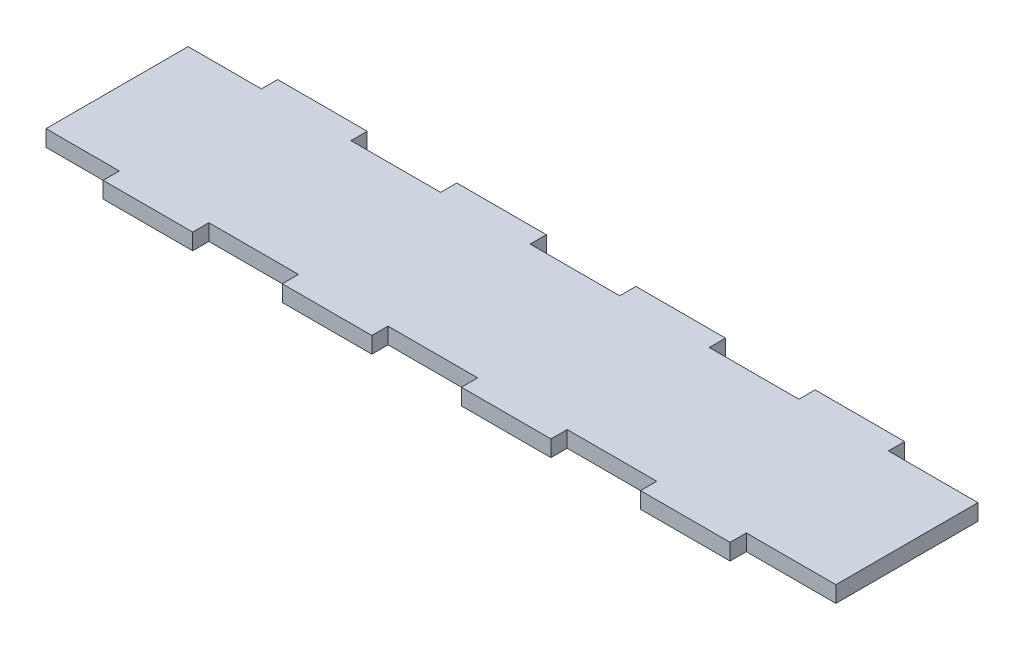
ISO-10303-21;
HEADER;
FILE_DESCRIPTION(('STEP AP214'),'2;1');
FILE_NAME('part.step','',(''),(''),'','','');
FILE_SCHEMA(('AUTOMOTIVE_DESIGN { 1 0 10303 214 1 1 1 1 }'));
ENDSEC;
DATA;
#1=APPLICATION_CONTEXT('core data for automotive mechanical design processes');
#2=APPLICATION_PROTOCOL_DEFINITION('international standard','automotive_design',2000,#1);
#3=PRODUCT_CONTEXT('',#1,'mechanical');
#4=PRODUCT('Part','Part','',(#3));
#5=PRODUCT_RELATED_PRODUCT_CATEGORY('part','',(#4));
#6=PRODUCT_DEFINITION_FORMATION('','',#4);
#7=PRODUCT_DEFINITION_CONTEXT('part definition',#1,'design');
#8=PRODUCT_DEFINITION('design','',#6,#7);
#9=PRODUCT_DEFINITION_SHAPE('','',#8);
#10=(LENGTH_UNIT() NAMED_UNIT(*) SI_UNIT(.MILLI.,.METRE.));
#11=(NAMED_UNIT(*) PLANE_ANGLE_UNIT() SI_UNIT($,.RADIAN.));
#12=(NAMED_UNIT(*) SI_UNIT($,.STERADIAN.) SOLID_ANGLE_UNIT());
#13=UNCERTAINTY_MEASURE_WITH_UNIT(LENGTH_MEASURE(1.E-05),#10,'distance_accuracy_value','');
#14=(GEOMETRIC_REPRESENTATION_CONTEXT(3) GLOBAL_UNCERTAINTY_ASSIGNED_CONTEXT((#13)) GLOBAL_UNIT_ASSIGNED_CONTEXT((#10,
#11,#12)) REPRESENTATION_CONTEXT('',''));
#15=CARTESIAN_POINT('',(0.,0.,0.));
#16=DIRECTION('',(0.,0.,1.));
#17=DIRECTION('',(1.,0.,0.));
#18=AXIS2_PLACEMENT_3D('',#15,#16,#17);
#19=CARTESIAN_POINT('',(0.,4.599999944,0.));
#20=DIRECTION('',(0.,-1.,0.));
#21=DIRECTION('',(0.,0.,-1.));
#22=AXIS2_PLACEMENT_3D('',#19,#20,#21);
#23=PLANE('',#22);
#24=DIRECTION('',(1.,0.,0.));
#25=VECTOR('',#24,1.);
#26=CARTESIAN_POINT('',(0.,4.599999944,-44.899999862));
#27=LINE('',#26,#25);
#28=CARTESIAN_POINT('',(4.599999944,4.599999944,-44.899999862));
#29=VERTEX_POINT('',#28);
#30=CARTESIAN_POINT('',(25.4,4.599999944,-44.899999862));
#31=VERTEX_POINT('',#30);
#32=EDGE_CURVE('E945',#29,#31,#27,.T.);
#33=ORIENTED_EDGE('',*,*,#32,.F.);
#34=DIRECTION('',(0.,0.,-1.));
#35=VECTOR('',#34,1.);
#36=CARTESIAN_POINT('',(4.599999944,4.599999944,-44.899999862));
#37=LINE('',#36,#35);
#38=CARTESIAN_POINT('',(4.599999944,4.599999944,-4.599999944));
#39=VERTEX_POINT('',#38);
#40=EDGE_CURVE('E52',#39,#29,#37,.T.);
#41=ORIENTED_EDGE('',*,*,#40,.F.);
#42=DIRECTION('',(1.,0.,0.));
#43=VECTOR('',#42,1.);
#44=CARTESIAN_POINT('',(0.,4.599999944,-4.599999944));
#45=LINE('',#44,#43);
#46=CARTESIAN_POINT('',(25.4,4.599999944,-4.599999944));
#47=VERTEX_POINT('',#46);
#48=EDGE_CURVE('E284',#39,#47,#45,.T.);
#49=ORIENTED_EDGE('',*,*,#48,.T.);
#50=DIRECTION('',(0.,0.,1.));
#51=VECTOR('',#50,1.);
#52=CARTESIAN_POINT('',(25.4,4.599999944,0.));
#53=LINE('',#52,#51);
#54=CARTESIAN_POINT('',(25.4,4.599999944,0.));
#55=VERTEX_POINT('',#54);
#56=EDGE_CURVE('E297',#47,#55,#53,.T.);
#57=ORIENTED_EDGE('',*,*,#56,.T.);
#58=DIRECTION('',(1.,0.,0.));
#59=VECTOR('',#58,1.);
#60=CARTESIAN_POINT('',(0.,4.599999944,0.));
#61=LINE('',#60,#59);
#62=CARTESIAN_POINT('',(50.8,4.599999944,0.));
#63=VERTEX_POINT('',#62);
#64=EDGE_CURVE('E399',#55,#63,#61,.T.);
#65=ORIENTED_EDGE('',*,*,#64,.T.);
#66=DIRECTION('',(0.,0.,1.));
#67=VECTOR('',#66,1.);
#68=CARTESIAN_POINT('',(50.8,4.599999944,0.));
#69=LINE('',#68,#67);
#70=CARTESIAN_POINT('',(50.8,4.599999944,-4.599999944));
#71=VERTEX_POINT('',#70);
#72=EDGE_CURVE('E315',#71,#63,#69,.T.);
#73=ORIENTED_EDGE('',*,*,#72,.F.);
#74=DIRECTION('',(1.,0.,0.));
#75=VECTOR('',#74,1.);
#76=CARTESIAN_POINT('',(0.,4.599999944,-4.599999944));
#77=LINE('',#76,#75);
#78=CARTESIAN_POINT('',(76.2,4.599999944,-4.599999944));
#79=VERTEX_POINT('',#78);
#80=EDGE_CURVE('E317',#71,#79,#77,.T.);
#81=ORIENTED_EDGE('',*,*,#80,.T.);
#82=DIRECTION('',(0.,0.,1.));
#83=VECTOR('',#82,1.);
#84=CARTESIAN_POINT('',(76.2,4.599999944,0.));
#85=LINE('',#84,#83);
#86=CARTESIAN_POINT('',(76.2,4.599999944,0.));
#87=VERTEX_POINT('',#86);
#88=EDGE_CURVE('E300',#79,#87,#85,.T.);
#89=ORIENTED_EDGE('',*,*,#88,.T.);
#90=CARTESIAN_POINT('',(101.6,4.599999944,0.));
#91=VERTEX_POINT('',#90);
#92=EDGE_CURVE('E443',#87,#91,#61,.T.);
#93=ORIENTED_EDGE('',*,*,#92,.T.);
#94=DIRECTION('',(0.,0.,1.));
#95=VECTOR('',#94,1.);
#96=CARTESIAN_POINT('',(101.6,4.599999944,0.));
#97=LINE('',#96,#95);
#98=CARTESIAN_POINT('',(101.6,4.599999944,-4.599999944));
#99=VERTEX_POINT('',#98);
#100=EDGE_CURVE('E339',#99,#91,#97,.T.);
#101=ORIENTED_EDGE('',*,*,#100,.F.);
#102=DIRECTION('',(1.,0.,0.));
#103=VECTOR('',#102,1.);
#104=CARTESIAN_POINT('',(0.,4.599999944,-4.599999944));
#105=LINE('',#104,#103);
#106=CARTESIAN_POINT('',(127.,4.599999944,-4.599999944));
#107=VERTEX_POINT('',#106);
#108=EDGE_CURVE('E341',#99,#107,#105,.T.);
#109=ORIENTED_EDGE('',*,*,#108,.T.);
#110=DIRECTION('',(0.,0.,1.));
#111=VECTOR('',#110,1.);
#112=CARTESIAN_POINT('',(127.,4.599999944,0.));
#113=LINE('',#112,#111);
#114=CARTESIAN_POINT('',(127.,4.599999944,0.));
#115=VERTEX_POINT('',#114);
#116=EDGE_CURVE('E314',#107,#115,#113,.T.);
#117=ORIENTED_EDGE('',*,*,#116,.T.);
#118=CARTESIAN_POINT('',(152.4,4.599999944,0.));
#119=VERTEX_POINT('',#118);
#120=EDGE_CURVE('E397',#115,#119,#61,.T.);
#121=ORIENTED_EDGE('',*,*,#120,.T.);
#122=DIRECTION('',(0.,0.,1.));
#123=VECTOR('',#122,1.);
#124=CARTESIAN_POINT('',(152.4,4.599999944,0.));
#125=LINE('',#124,#123);
#126=CARTESIAN_POINT('',(152.4,4.599999944,-4.599999944));
#127=VERTEX_POINT('',#126);
#128=EDGE_CURVE('E366',#127,#119,#125,.T.);
#129=ORIENTED_EDGE('',*,*,#128,.F.);
#130=DIRECTION('',(-1.,0.,0.));
#131=VECTOR('',#130,1.);
#132=CARTESIAN_POINT('',(0.,4.599999944,-4.59999994399998));
#133=LINE('',#132,#131);
#134=CARTESIAN_POINT('',(177.8,4.599999944,-4.599999944));
#135=VERTEX_POINT('',#134);
#136=EDGE_CURVE('E338',#135,#127,#133,.T.);
#137=ORIENTED_EDGE('',*,*,#136,.F.);
#138=DIRECTION('',(0.,0.,1.));
#139=VECTOR('',#138,1.);
#140=CARTESIAN_POINT('',(177.8,4.599999944,0.));
#141=LINE('',#140,#139);
#142=CARTESIAN_POINT('',(177.8,4.599999944,0.));
#143=VERTEX_POINT('',#142);
#144=EDGE_CURVE('E363',#135,#143,#141,.T.);
#145=ORIENTED_EDGE('',*,*,#144,.T.);
#146=CARTESIAN_POINT('',(203.2,4.599999944,0.));
#147=VERTEX_POINT('',#146);
#148=EDGE_CURVE('E394',#143,#147,#61,.T.);
#149=ORIENTED_EDGE('',*,*,#148,.T.);
#150=DIRECTION('',(0.,0.,1.));
#151=VECTOR('',#150,1.);
#152=CARTESIAN_POINT('',(203.2,4.599999944,-4.599999944));
#153=LINE('',#152,#151);
#154=CARTESIAN_POINT('',(203.2,4.599999944,-4.599999944));
#155=VERTEX_POINT('',#154);
#156=EDGE_CURVE('E386',#155,#147,#153,.T.);
#157=ORIENTED_EDGE('',*,*,#156,.F.);
#158=DIRECTION('',(1.,0.,0.));
#159=VECTOR('',#158,1.);
#160=CARTESIAN_POINT('',(203.2,4.599999944,-4.599999944));
#161=LINE('',#160,#159);
#162=CARTESIAN_POINT('',(228.6,4.599999944,-4.599999944));
#163=VERTEX_POINT('',#162);
#164=EDGE_CURVE('E362',#155,#163,#161,.T.);
#165=ORIENTED_EDGE('',*,*,#164,.T.);
#166=DIRECTION('',(0.,0.,-1.));
#167=VECTOR('',#166,1.);
#168=CARTESIAN_POINT('',(228.6,4.599999944,0.));
#169=LINE('',#168,#167);
#170=CARTESIAN_POINT('',(228.6,4.599999944,-44.899999862));
#171=VERTEX_POINT('',#170);
#172=EDGE_CURVE('E400',#163,#171,#169,.T.);
#173=ORIENTED_EDGE('',*,*,#172,.T.);
#174=DIRECTION('',(1.,0.,0.));
#175=VECTOR('',#174,1.);
#176=CARTESIAN_POINT('',(203.2,4.599999944,-44.899999862));
#177=LINE('',#176,#175);
#178=CARTESIAN_POINT('',(203.2,4.599999944,-44.899999862));
#179=VERTEX_POINT('',#178);
#180=EDGE_CURVE('E628',#179,#171,#177,.T.);
#181=ORIENTED_EDGE('',*,*,#180,.F.);
#182=DIRECTION('',(0.,0.,-1.));
#183=VECTOR('',#182,1.);
#184=CARTESIAN_POINT('',(203.2,4.599999944,-44.899999862));
#185=LINE('',#184,#183);
#186=CARTESIAN_POINT('',(203.2,4.599999944,-49.499999806));
#187=VERTEX_POINT('',#186);
#188=EDGE_CURVE('E631',#179,#187,#185,.T.);
#189=ORIENTED_EDGE('',*,*,#188,.T.);
#190=DIRECTION('',(-1.,0.,0.));
#191=VECTOR('',#190,1.);
#192=CARTESIAN_POINT('',(0.,4.599999944,-49.499999806));
#193=LINE('',#192,#191);
#194=CARTESIAN_POINT('',(177.8,4.599999944,-49.499999806));
#195=VERTEX_POINT('',#194);
#196=EDGE_CURVE('E11',#187,#195,#193,.T.);
#197=ORIENTED_EDGE('',*,*,#196,.T.);
#198=DIRECTION('',(0.,0.,-1.));
#199=VECTOR('',#198,1.);
#200=CARTESIAN_POINT('',(177.8,4.599999944,-49.499999806));
#201=LINE('',#200,#199);
#202=CARTESIAN_POINT('',(177.8,4.599999944,-44.899999862));
#203=VERTEX_POINT('',#202);
#204=EDGE_CURVE('E614',#203,#195,#201,.T.);
#205=ORIENTED_EDGE('',*,*,#204,.F.);
#206=DIRECTION('',(-1.,0.,0.));
#207=VECTOR('',#206,1.);
#208=CARTESIAN_POINT('',(0.,4.599999944,-44.899999862));
#209=LINE('',#208,#207);
#210=CARTESIAN_POINT('',(152.4,4.599999944,-44.899999862));
#211=VERTEX_POINT('',#210);
#212=EDGE_CURVE('E611',#203,#211,#209,.T.);
#213=ORIENTED_EDGE('',*,*,#212,.T.);
#214=DIRECTION('',(0.,0.,-1.));
#215=VECTOR('',#214,1.);
#216=CARTESIAN_POINT('',(152.4,4.599999944,-49.499999806));
#217=LINE('',#216,#215);
#218=CARTESIAN_POINT('',(152.4,4.599999944,-49.499999806));
#219=VERTEX_POINT('',#218);
#220=EDGE_CURVE('E606',#211,#219,#217,.T.);
#221=ORIENTED_EDGE('',*,*,#220,.T.);
#222=CARTESIAN_POINT('',(127.,4.599999944,-49.499999806));
#223=VERTEX_POINT('',#222);
#224=EDGE_CURVE('E43',#219,#223,#193,.T.);
#225=ORIENTED_EDGE('',*,*,#224,.T.);
#226=DIRECTION('',(0.,0.,-1.));
#227=VECTOR('',#226,1.);
#228=CARTESIAN_POINT('',(127.,4.599999944,-49.499999806));
#229=LINE('',#228,#227);
#230=CARTESIAN_POINT('',(127.,4.599999944,-44.899999862));
#231=VERTEX_POINT('',#230);
#232=EDGE_CURVE('E590',#231,#223,#229,.T.);
#233=ORIENTED_EDGE('',*,*,#232,.F.);
#234=DIRECTION('',(1.,0.,0.));
#235=VECTOR('',#234,1.);
#236=CARTESIAN_POINT('',(0.,4.599999944,-44.899999862));
#237=LINE('',#236,#235);
#238=CARTESIAN_POINT('',(101.6,4.599999944,-44.899999862));
#239=VERTEX_POINT('',#238);
#240=EDGE_CURVE('E585',#239,#231,#237,.T.);
#241=ORIENTED_EDGE('',*,*,#240,.F.);
#242=DIRECTION('',(0.,0.,-1.));
#243=VECTOR('',#242,1.);
#244=CARTESIAN_POINT('',(101.6,4.599999944,-49.499999806));
#245=LINE('',#244,#243);
#246=CARTESIAN_POINT('',(101.6,4.599999944,-49.499999806));
#247=VERTEX_POINT('',#246);
#248=EDGE_CURVE('E592',#239,#247,#245,.T.);
#249=ORIENTED_EDGE('',*,*,#248,.T.);
#250=CARTESIAN_POINT('',(76.2,4.599999944,-49.499999806));
#251=VERTEX_POINT('',#250);
#252=EDGE_CURVE('E404',#247,#251,#193,.T.);
#253=ORIENTED_EDGE('',*,*,#252,.T.);
#254=DIRECTION('',(0.,0.,-1.));
#255=VECTOR('',#254,1.);
#256=CARTESIAN_POINT('',(76.2,4.599999944,-49.499999806));
#257=LINE('',#256,#255);
#258=CARTESIAN_POINT('',(76.2,4.599999944,-44.899999862));
#259=VERTEX_POINT('',#258);
#260=EDGE_CURVE('E570',#259,#251,#257,.T.);
#261=ORIENTED_EDGE('',*,*,#260,.F.);
#262=DIRECTION('',(1.,0.,0.));
#263=VECTOR('',#262,1.);
#264=CARTESIAN_POINT('',(0.,4.599999944,-44.899999862));
#265=LINE('',#264,#263);
#266=CARTESIAN_POINT('',(50.8,4.599999944,-44.899999862));
#267=VERTEX_POINT('',#266);
#268=EDGE_CURVE('E559',#267,#259,#265,.T.);
#269=ORIENTED_EDGE('',*,*,#268,.F.);
#270=DIRECTION('',(0.,0.,-1.));
#271=VECTOR('',#270,1.);
#272=CARTESIAN_POINT('',(50.8,4.599999944,-49.499999806));
#273=LINE('',#272,#271);
#274=CARTESIAN_POINT('',(50.8,4.599999944,-49.499999806));
#275=VERTEX_POINT('',#274);
#276=EDGE_CURVE('E563',#267,#275,#273,.T.);
#277=ORIENTED_EDGE('',*,*,#276,.T.);
#278=CARTESIAN_POINT('',(25.4,4.599999944,-49.499999806));
#279=VERTEX_POINT('',#278);
#280=EDGE_CURVE('E45',#275,#279,#193,.T.);
#281=ORIENTED_EDGE('',*,*,#280,.T.);
#282=DIRECTION('',(0.,0.,-1.));
#283=VECTOR('',#282,1.);
#284=CARTESIAN_POINT('',(25.4,4.599999944,-49.499999806));
#285=LINE('',#284,#283);
#286=EDGE_CURVE('E60',#31,#279,#285,.T.);
#287=ORIENTED_EDGE('',*,*,#286,.F.);
#288=EDGE_LOOP('',(#33,#41,#49,#57,#65,#73,#81,#89,#93,#101,#109,#117,#121,#129,#137,#145,#149,
#157,#165,#173,#181,#189,#197,#205,#213,#221,#225,#233,#241,#249,#253,#261,#269,#277,#281,#287));
#289=FACE_BOUND('',#288,.T.);
#290=ADVANCED_FACE('F34',(#289),#23,.F.);
#291=CARTESIAN_POINT('',(0.,0.,0.));
#292=DIRECTION('',(0.,-1.,0.));
#293=DIRECTION('',(0.,0.,-1.));
#294=AXIS2_PLACEMENT_3D('',#291,#292,#293);
#295=PLANE('',#294);
#296=DIRECTION('',(0.,0.,-1.));
#297=VECTOR('',#296,1.);
#298=CARTESIAN_POINT('',(4.599999944,0.,-44.899999862));
#299=LINE('',#298,#297);
#300=CARTESIAN_POINT('',(4.599999944,0.,-4.599999944));
#301=VERTEX_POINT('',#300);
#302=CARTESIAN_POINT('',(4.599999944,0.,-44.899999862));
#303=VERTEX_POINT('',#302);
#304=EDGE_CURVE('E269',#301,#303,#299,.T.);
#305=ORIENTED_EDGE('',*,*,#304,.T.);
#306=DIRECTION('',(1.,0.,0.));
#307=VECTOR('',#306,1.);
#308=CARTESIAN_POINT('',(0.,0.,-44.899999862));
#309=LINE('',#308,#307);
#310=CARTESIAN_POINT('',(25.4,0.,-44.899999862));
#311=VERTEX_POINT('',#310);
#312=EDGE_CURVE('E940',#303,#311,#309,.T.);
#313=ORIENTED_EDGE('',*,*,#312,.T.);
#314=DIRECTION('',(0.,0.,-1.));
#315=VECTOR('',#314,1.);
#316=CARTESIAN_POINT('',(25.4,0.,-49.499999806));
#317=LINE('',#316,#315);
#318=CARTESIAN_POINT('',(25.4,0.,-49.499999806));
#319=VERTEX_POINT('',#318);
#320=EDGE_CURVE('E943',#311,#319,#317,.T.);
#321=ORIENTED_EDGE('',*,*,#320,.T.);
#322=DIRECTION('',(-1.,0.,0.));
#323=VECTOR('',#322,1.);
#324=CARTESIAN_POINT('',(0.,0.,-49.499999806));
#325=LINE('',#324,#323);
#326=CARTESIAN_POINT('',(50.8,0.,-49.499999806));
#327=VERTEX_POINT('',#326);
#328=EDGE_CURVE('E38',#327,#319,#325,.T.);
#329=ORIENTED_EDGE('',*,*,#328,.F.);
#330=DIRECTION('',(0.,0.,-1.));
#331=VECTOR('',#330,1.);
#332=CARTESIAN_POINT('',(50.8,0.,-49.499999806));
#333=LINE('',#332,#331);
#334=CARTESIAN_POINT('',(50.8,0.,-44.899999862));
#335=VERTEX_POINT('',#334);
#336=EDGE_CURVE('E558',#335,#327,#333,.T.);
#337=ORIENTED_EDGE('',*,*,#336,.F.);
#338=DIRECTION('',(1.,0.,0.));
#339=VECTOR('',#338,1.);
#340=CARTESIAN_POINT('',(0.,0.,-44.899999862));
#341=LINE('',#340,#339);
#342=CARTESIAN_POINT('',(76.2,0.,-44.899999862));
#343=VERTEX_POINT('',#342);
#344=EDGE_CURVE('E556',#335,#343,#341,.T.);
#345=ORIENTED_EDGE('',*,*,#344,.T.);
#346=DIRECTION('',(0.,0.,-1.));
#347=VECTOR('',#346,1.);
#348=CARTESIAN_POINT('',(76.2,0.,-49.499999806));
#349=LINE('',#348,#347);
#350=CARTESIAN_POINT('',(76.2,0.,-49.499999806));
#351=VERTEX_POINT('',#350);
#352=EDGE_CURVE('E553',#343,#351,#349,.T.);
#353=ORIENTED_EDGE('',*,*,#352,.T.);
#354=CARTESIAN_POINT('',(101.6,0.,-49.499999806));
#355=VERTEX_POINT('',#354);
#356=EDGE_CURVE('E415',#355,#351,#325,.T.);
#357=ORIENTED_EDGE('',*,*,#356,.F.);
#358=DIRECTION('',(0.,0.,-1.));
#359=VECTOR('',#358,1.);
#360=CARTESIAN_POINT('',(101.6,0.,-49.499999806));
#361=LINE('',#360,#359);
#362=CARTESIAN_POINT('',(101.6,0.,-44.899999862));
#363=VERTEX_POINT('',#362);
#364=EDGE_CURVE('E550',#363,#355,#361,.T.);
#365=ORIENTED_EDGE('',*,*,#364,.F.);
#366=DIRECTION('',(1.,0.,0.));
#367=VECTOR('',#366,1.);
#368=CARTESIAN_POINT('',(0.,0.,-44.899999862));
#369=LINE('',#368,#367);
#370=CARTESIAN_POINT('',(127.,0.,-44.899999862));
#371=VERTEX_POINT('',#370);
#372=EDGE_CURVE('E587',#363,#371,#369,.T.);
#373=ORIENTED_EDGE('',*,*,#372,.T.);
#374=DIRECTION('',(0.,0.,-1.));
#375=VECTOR('',#374,1.);
#376=CARTESIAN_POINT('',(127.,0.,-49.499999806));
#377=LINE('',#376,#375);
#378=CARTESIAN_POINT('',(127.,0.,-49.499999806));
#379=VERTEX_POINT('',#378);
#380=EDGE_CURVE('E582',#371,#379,#377,.T.);
#381=ORIENTED_EDGE('',*,*,#380,.T.);
#382=CARTESIAN_POINT('',(152.4,0.,-49.499999806));
#383=VERTEX_POINT('',#382);
#384=EDGE_CURVE('E533',#383,#379,#325,.T.);
#385=ORIENTED_EDGE('',*,*,#384,.F.);
#386=DIRECTION('',(0.,0.,-1.));
#387=VECTOR('',#386,1.);
#388=CARTESIAN_POINT('',(152.4,0.,-49.499999806));
#389=LINE('',#388,#387);
#390=CARTESIAN_POINT('',(152.4,0.,-44.899999862));
#391=VERTEX_POINT('',#390);
#392=EDGE_CURVE('E608',#391,#383,#389,.T.);
#393=ORIENTED_EDGE('',*,*,#392,.F.);
#394=DIRECTION('',(-1.,0.,0.));
#395=VECTOR('',#394,1.);
#396=CARTESIAN_POINT('',(0.,0.,-44.899999862));
#397=LINE('',#396,#395);
#398=CARTESIAN_POINT('',(177.8,0.,-44.899999862));
#399=VERTEX_POINT('',#398);
#400=EDGE_CURVE('E603',#399,#391,#397,.T.);
#401=ORIENTED_EDGE('',*,*,#400,.F.);
#402=DIRECTION('',(0.,0.,-1.));
#403=VECTOR('',#402,1.);
#404=CARTESIAN_POINT('',(177.8,0.,-49.499999806));
#405=LINE('',#404,#403);
#406=CARTESIAN_POINT('',(177.8,0.,-49.499999806));
#407=VERTEX_POINT('',#406);
#408=EDGE_CURVE('E605',#399,#407,#405,.T.);
#409=ORIENTED_EDGE('',*,*,#408,.T.);
#410=CARTESIAN_POINT('',(203.2,0.,-49.499999806));
#411=VERTEX_POINT('',#410);
#412=EDGE_CURVE('E398',#411,#407,#325,.T.);
#413=ORIENTED_EDGE('',*,*,#412,.F.);
#414=DIRECTION('',(0.,0.,-1.));
#415=VECTOR('',#414,1.);
#416=CARTESIAN_POINT('',(203.2,0.,-44.899999862));
#417=LINE('',#416,#415);
#418=CARTESIAN_POINT('',(203.2,0.,-44.899999862));
#419=VERTEX_POINT('',#418);
#420=EDGE_CURVE('E625',#419,#411,#417,.T.);
#421=ORIENTED_EDGE('',*,*,#420,.F.);
#422=DIRECTION('',(1.,0.,0.));
#423=VECTOR('',#422,1.);
#424=CARTESIAN_POINT('',(203.2,0.,-44.899999862));
#425=LINE('',#424,#423);
#426=CARTESIAN_POINT('',(228.6,0.,-44.899999862));
#427=VERTEX_POINT('',#426);
#428=EDGE_CURVE('E627',#419,#427,#425,.T.);
#429=ORIENTED_EDGE('',*,*,#428,.T.);
#430=DIRECTION('',(0.,0.,-1.));
#431=VECTOR('',#430,1.);
#432=CARTESIAN_POINT('',(228.6,0.,0.));
#433=LINE('',#432,#431);
#434=CARTESIAN_POINT('',(228.6,0.,-4.599999944));
#435=VERTEX_POINT('',#434);
#436=EDGE_CURVE('E408',#435,#427,#433,.T.);
#437=ORIENTED_EDGE('',*,*,#436,.F.);
#438=DIRECTION('',(1.,0.,0.));
#439=VECTOR('',#438,1.);
#440=CARTESIAN_POINT('',(203.2,0.,-4.599999944));
#441=LINE('',#440,#439);
#442=CARTESIAN_POINT('',(203.2,0.,-4.599999944));
#443=VERTEX_POINT('',#442);
#444=EDGE_CURVE('E388',#443,#435,#441,.T.);
#445=ORIENTED_EDGE('',*,*,#444,.F.);
#446=DIRECTION('',(0.,0.,1.));
#447=VECTOR('',#446,1.);
#448=CARTESIAN_POINT('',(203.2,0.,-4.599999944));
#449=LINE('',#448,#447);
#450=CARTESIAN_POINT('',(203.2,0.,0.));
#451=VERTEX_POINT('',#450);
#452=EDGE_CURVE('E379',#443,#451,#449,.T.);
#453=ORIENTED_EDGE('',*,*,#452,.T.);
#454=DIRECTION('',(1.,0.,0.));
#455=VECTOR('',#454,1.);
#456=CARTESIAN_POINT('',(0.,0.,0.));
#457=LINE('',#456,#455);
#458=CARTESIAN_POINT('',(177.8,0.,0.));
#459=VERTEX_POINT('',#458);
#460=EDGE_CURVE('E302',#459,#451,#457,.T.);
#461=ORIENTED_EDGE('',*,*,#460,.F.);
#462=DIRECTION('',(0.,0.,1.));
#463=VECTOR('',#462,1.);
#464=CARTESIAN_POINT('',(177.8,0.,0.));
#465=LINE('',#464,#463);
#466=CARTESIAN_POINT('',(177.8,0.,-4.599999944));
#467=VERTEX_POINT('',#466);
#468=EDGE_CURVE('E354',#467,#459,#465,.T.);
#469=ORIENTED_EDGE('',*,*,#468,.F.);
#470=DIRECTION('',(-1.,0.,0.));
#471=VECTOR('',#470,1.);
#472=CARTESIAN_POINT('',(0.,0.,-4.59999994399998));
#473=LINE('',#472,#471);
#474=CARTESIAN_POINT('',(152.4,0.,-4.599999944));
#475=VERTEX_POINT('',#474);
#476=EDGE_CURVE('E367',#467,#475,#473,.T.);
#477=ORIENTED_EDGE('',*,*,#476,.T.);
#478=DIRECTION('',(0.,0.,1.));
#479=VECTOR('',#478,1.);
#480=CARTESIAN_POINT('',(152.4,0.,0.));
#481=LINE('',#480,#479);
#482=CARTESIAN_POINT('',(152.4,0.,0.));
#483=VERTEX_POINT('',#482);
#484=EDGE_CURVE('E372',#475,#483,#481,.T.);
#485=ORIENTED_EDGE('',*,*,#484,.T.);
#486=CARTESIAN_POINT('',(127.,0.,0.));
#487=VERTEX_POINT('',#486);
#488=EDGE_CURVE('E406',#487,#483,#457,.T.);
#489=ORIENTED_EDGE('',*,*,#488,.F.);
#490=DIRECTION('',(0.,0.,1.));
#491=VECTOR('',#490,1.);
#492=CARTESIAN_POINT('',(127.,0.,0.));
#493=LINE('',#492,#491);
#494=CARTESIAN_POINT('',(127.,0.,-4.599999944));
#495=VERTEX_POINT('',#494);
#496=EDGE_CURVE('E342',#495,#487,#493,.T.);
#497=ORIENTED_EDGE('',*,*,#496,.F.);
#498=DIRECTION('',(1.,0.,0.));
#499=VECTOR('',#498,1.);
#500=CARTESIAN_POINT('',(0.,0.,-4.599999944));
#501=LINE('',#500,#499);
#502=CARTESIAN_POINT('',(101.6,0.,-4.599999944));
#503=VERTEX_POINT('',#502);
#504=EDGE_CURVE('E349',#503,#495,#501,.T.);
#505=ORIENTED_EDGE('',*,*,#504,.F.);
#506=DIRECTION('',(0.,0.,1.));
#507=VECTOR('',#506,1.);
#508=CARTESIAN_POINT('',(101.6,0.,0.));
#509=LINE('',#508,#507);
#510=CARTESIAN_POINT('',(101.6,0.,0.));
#511=VERTEX_POINT('',#510);
#512=EDGE_CURVE('E330',#503,#511,#509,.T.);
#513=ORIENTED_EDGE('',*,*,#512,.T.);
#514=CARTESIAN_POINT('',(76.2,0.,0.));
#515=VERTEX_POINT('',#514);
#516=EDGE_CURVE('E417',#515,#511,#457,.T.);
#517=ORIENTED_EDGE('',*,*,#516,.F.);
#518=DIRECTION('',(0.,0.,1.));
#519=VECTOR('',#518,1.);
#520=CARTESIAN_POINT('',(76.2,0.,0.));
#521=LINE('',#520,#519);
#522=CARTESIAN_POINT('',(76.2,0.,-4.599999944));
#523=VERTEX_POINT('',#522);
#524=EDGE_CURVE('E318',#523,#515,#521,.T.);
#525=ORIENTED_EDGE('',*,*,#524,.F.);
#526=DIRECTION('',(1.,0.,0.));
#527=VECTOR('',#526,1.);
#528=CARTESIAN_POINT('',(0.,0.,-4.599999944));
#529=LINE('',#528,#527);
#530=CARTESIAN_POINT('',(50.8,0.,-4.599999944));
#531=VERTEX_POINT('',#530);
#532=EDGE_CURVE('E325',#531,#523,#529,.T.);
#533=ORIENTED_EDGE('',*,*,#532,.F.);
#534=DIRECTION('',(0.,0.,1.));
#535=VECTOR('',#534,1.);
#536=CARTESIAN_POINT('',(50.8,0.,0.));
#537=LINE('',#536,#535);
#538=CARTESIAN_POINT('',(50.8,0.,0.));
#539=VERTEX_POINT('',#538);
#540=EDGE_CURVE('E306',#531,#539,#537,.T.);
#541=ORIENTED_EDGE('',*,*,#540,.T.);
#542=CARTESIAN_POINT('',(25.4,0.,0.));
#543=VERTEX_POINT('',#542);
#544=EDGE_CURVE('E407',#543,#539,#457,.T.);
#545=ORIENTED_EDGE('',*,*,#544,.F.);
#546=DIRECTION('',(0.,0.,1.));
#547=VECTOR('',#546,1.);
#548=CARTESIAN_POINT('',(25.4,0.,0.));
#549=LINE('',#548,#547);
#550=CARTESIAN_POINT('',(25.4,0.,-4.599999944));
#551=VERTEX_POINT('',#550);
#552=EDGE_CURVE('E289',#551,#543,#549,.T.);
#553=ORIENTED_EDGE('',*,*,#552,.F.);
#554=DIRECTION('',(1.,0.,0.));
#555=VECTOR('',#554,1.);
#556=CARTESIAN_POINT('',(0.,0.,-4.599999944));
#557=LINE('',#556,#555);
#558=EDGE_CURVE('E282',#301,#551,#557,.T.);
#559=ORIENTED_EDGE('',*,*,#558,.F.);
#560=EDGE_LOOP('',(#305,#313,#321,#329,#337,#345,#353,#357,#365,#373,#381,#385,#393,#401,#409,
#413,#421,#429,#437,#445,#453,#461,#469,#477,#485,#489,#497,#505,#513,#517,#525,#533,#541,#545,
#553,#559));
#561=FACE_BOUND('',#560,.T.);
#562=ADVANCED_FACE('F287',(#561),#295,.T.);
#563=CARTESIAN_POINT('',(0.,4.599999944,-49.499999806));
#564=DIRECTION('',(0.,0.,1.));
#565=DIRECTION('',(1.,0.,0.));
#566=AXIS2_PLACEMENT_3D('',#563,#564,#565);
#567=PLANE('',#566);
#568=ORIENTED_EDGE('',*,*,#328,.T.);
#569=DIRECTION('',(0.,1.,0.));
#570=VECTOR('',#569,1.);
#571=CARTESIAN_POINT('',(25.4,0.,-49.499999806));
#572=LINE('',#571,#570);
#573=EDGE_CURVE('E566',#319,#279,#572,.T.);
#574=ORIENTED_EDGE('',*,*,#573,.T.);
#575=ORIENTED_EDGE('',*,*,#280,.F.);
#576=DIRECTION('',(0.,1.,0.));
#577=VECTOR('',#576,1.);
#578=CARTESIAN_POINT('',(50.8,0.,-49.499999806));
#579=LINE('',#578,#577);
#580=EDGE_CURVE('E579',#327,#275,#579,.T.);
#581=ORIENTED_EDGE('',*,*,#580,.F.);
#582=EDGE_LOOP('',(#568,#574,#575,#581));
#583=FACE_BOUND('',#582,.T.);
#584=ADVANCED_FACE('F489',(#583),#567,.F.);
#585=ORIENTED_EDGE('',*,*,#356,.T.);
#586=DIRECTION('',(0.,1.,0.));
#587=VECTOR('',#586,1.);
#588=CARTESIAN_POINT('',(76.2,0.,-49.499999806));
#589=LINE('',#588,#587);
#590=EDGE_CURVE('E544',#351,#251,#589,.T.);
#591=ORIENTED_EDGE('',*,*,#590,.T.);
#592=ORIENTED_EDGE('',*,*,#252,.F.);
#593=DIRECTION('',(0.,1.,0.));
#594=VECTOR('',#593,1.);
#595=CARTESIAN_POINT('',(101.6,0.,-49.499999806));
#596=LINE('',#595,#594);
#597=EDGE_CURVE('E546',#355,#247,#596,.T.);
#598=ORIENTED_EDGE('',*,*,#597,.F.);
#599=EDGE_LOOP('',(#585,#591,#592,#598));
#600=FACE_BOUND('',#599,.T.);
#601=ADVANCED_FACE('F496',(#600),#567,.F.);
#602=ORIENTED_EDGE('',*,*,#384,.T.);
#603=DIRECTION('',(0.,1.,0.));
#604=VECTOR('',#603,1.);
#605=CARTESIAN_POINT('',(127.,0.,-49.499999806));
#606=LINE('',#605,#604);
#607=EDGE_CURVE('E589',#379,#223,#606,.T.);
#608=ORIENTED_EDGE('',*,*,#607,.T.);
#609=ORIENTED_EDGE('',*,*,#224,.F.);
#610=DIRECTION('',(0.,1.,0.));
#611=VECTOR('',#610,1.);
#612=CARTESIAN_POINT('',(152.4,0.,-49.499999806));
#613=LINE('',#612,#611);
#614=EDGE_CURVE('E621',#383,#219,#613,.T.);
#615=ORIENTED_EDGE('',*,*,#614,.F.);
#616=EDGE_LOOP('',(#602,#608,#609,#615));
#617=FACE_BOUND('',#616,.T.);
#618=ADVANCED_FACE('F518',(#617),#567,.F.);
#619=ORIENTED_EDGE('',*,*,#412,.T.);
#620=DIRECTION('',(0.,1.,0.));
#621=VECTOR('',#620,1.);
#622=CARTESIAN_POINT('',(177.8,0.,-49.499999806));
#623=LINE('',#622,#621);
#624=EDGE_CURVE('E529',#407,#195,#623,.T.);
#625=ORIENTED_EDGE('',*,*,#624,.T.);
#626=ORIENTED_EDGE('',*,*,#196,.F.);
#627=DIRECTION('',(0.,1.,0.));
#628=VECTOR('',#627,1.);
#629=CARTESIAN_POINT('',(203.2,0.,-49.499999806));
#630=LINE('',#629,#628);
#631=EDGE_CURVE('E530',#411,#187,#630,.T.);
#632=ORIENTED_EDGE('',*,*,#631,.F.);
#633=EDGE_LOOP('',(#619,#625,#626,#632));
#634=FACE_BOUND('',#633,.T.);
#635=ADVANCED_FACE('F498',(#634),#567,.F.);
#636=CARTESIAN_POINT('',(0.,4.599999944,0.));
#637=DIRECTION('',(0.,0.,-1.));
#638=DIRECTION('',(-1.,0.,0.));
#639=AXIS2_PLACEMENT_3D('',#636,#637,#638);
#640=PLANE('',#639);
#641=DIRECTION('',(0.,1.,0.));
#642=VECTOR('',#641,1.);
#643=CARTESIAN_POINT('',(25.4,0.,0.));
#644=LINE('',#643,#642);
#645=EDGE_CURVE('E292',#543,#55,#644,.T.);
#646=ORIENTED_EDGE('',*,*,#645,.F.);
#647=ORIENTED_EDGE('',*,*,#544,.T.);
#648=DIRECTION('',(0.,1.,0.));
#649=VECTOR('',#648,1.);
#650=CARTESIAN_POINT('',(50.8,0.,0.));
#651=LINE('',#650,#649);
#652=EDGE_CURVE('E309',#539,#63,#651,.T.);
#653=ORIENTED_EDGE('',*,*,#652,.T.);
#654=ORIENTED_EDGE('',*,*,#64,.F.);
#655=EDGE_LOOP('',(#646,#647,#653,#654));
#656=FACE_BOUND('',#655,.T.);
#657=ADVANCED_FACE('F36',(#656),#640,.F.);
#658=DIRECTION('',(0.,1.,0.));
#659=VECTOR('',#658,1.);
#660=CARTESIAN_POINT('',(76.2,0.,0.));
#661=LINE('',#660,#659);
#662=EDGE_CURVE('E312',#515,#87,#661,.T.);
#663=ORIENTED_EDGE('',*,*,#662,.F.);
#664=ORIENTED_EDGE('',*,*,#516,.T.);
#665=DIRECTION('',(0.,1.,0.));
#666=VECTOR('',#665,1.);
#667=CARTESIAN_POINT('',(101.6,0.,0.));
#668=LINE('',#667,#666);
#669=EDGE_CURVE('E333',#511,#91,#668,.T.);
#670=ORIENTED_EDGE('',*,*,#669,.T.);
#671=ORIENTED_EDGE('',*,*,#92,.F.);
#672=EDGE_LOOP('',(#663,#664,#670,#671));
#673=FACE_BOUND('',#672,.T.);
#674=ADVANCED_FACE('F463',(#673),#640,.F.);
#675=DIRECTION('',(0.,1.,0.));
#676=VECTOR('',#675,1.);
#677=CARTESIAN_POINT('',(127.,0.,0.));
#678=LINE('',#677,#676);
#679=EDGE_CURVE('E336',#487,#115,#678,.T.);
#680=ORIENTED_EDGE('',*,*,#679,.F.);
#681=ORIENTED_EDGE('',*,*,#488,.T.);
#682=DIRECTION('',(0.,1.,0.));
#683=VECTOR('',#682,1.);
#684=CARTESIAN_POINT('',(152.4,0.,0.));
#685=LINE('',#684,#683);
#686=EDGE_CURVE('E355',#483,#119,#685,.T.);
#687=ORIENTED_EDGE('',*,*,#686,.T.);
#688=ORIENTED_EDGE('',*,*,#120,.F.);
#689=EDGE_LOOP('',(#680,#681,#687,#688));
#690=FACE_BOUND('',#689,.T.);
#691=ADVANCED_FACE('F428',(#690),#640,.F.);
#692=DIRECTION('',(0.,1.,0.));
#693=VECTOR('',#692,1.);
#694=CARTESIAN_POINT('',(177.8,0.,0.));
#695=LINE('',#694,#693);
#696=EDGE_CURVE('E358',#459,#143,#695,.T.);
#697=ORIENTED_EDGE('',*,*,#696,.F.);
#698=ORIENTED_EDGE('',*,*,#460,.T.);
#699=DIRECTION('',(0.,1.,0.));
#700=VECTOR('',#699,1.);
#701=CARTESIAN_POINT('',(203.2,0.,0.));
#702=LINE('',#701,#700);
#703=EDGE_CURVE('E382',#451,#147,#702,.T.);
#704=ORIENTED_EDGE('',*,*,#703,.T.);
#705=ORIENTED_EDGE('',*,*,#148,.F.);
#706=EDGE_LOOP('',(#697,#698,#704,#705));
#707=FACE_BOUND('',#706,.T.);
#708=ADVANCED_FACE('F501',(#707),#640,.F.);
#709=CARTESIAN_POINT('',(228.6,4.599999944,0.));
#710=DIRECTION('',(-1.,0.,0.));
#711=DIRECTION('',(0.,0.,1.));
#712=AXIS2_PLACEMENT_3D('',#709,#710,#711);
#713=PLANE('',#712);
#714=ORIENTED_EDGE('',*,*,#436,.T.);
#715=DIRECTION('',(0.,1.,0.));
#716=VECTOR('',#715,1.);
#717=CARTESIAN_POINT('',(228.6,0.,-44.899999862));
#718=LINE('',#717,#716);
#719=EDGE_CURVE('E615',#427,#171,#718,.T.);
#720=ORIENTED_EDGE('',*,*,#719,.T.);
#721=ORIENTED_EDGE('',*,*,#172,.F.);
#722=DIRECTION('',(0.,1.,0.));
#723=VECTOR('',#722,1.);
#724=CARTESIAN_POINT('',(228.6,0.,-4.599999944));
#725=LINE('',#724,#723);
#726=EDGE_CURVE('E377',#435,#163,#725,.T.);
#727=ORIENTED_EDGE('',*,*,#726,.F.);
#728=EDGE_LOOP('',(#714,#720,#721,#727));
#729=FACE_BOUND('',#728,.T.);
#730=ADVANCED_FACE('F499',(#729),#713,.F.);
#731=CARTESIAN_POINT('',(203.2,0.,-4.599999944));
#732=DIRECTION('',(-1.,0.,0.));
#733=DIRECTION('',(0.,0.,1.));
#734=AXIS2_PLACEMENT_3D('',#731,#732,#733);
#735=PLANE('',#734);
#736=ORIENTED_EDGE('',*,*,#156,.T.);
#737=ORIENTED_EDGE('',*,*,#703,.F.);
#738=ORIENTED_EDGE('',*,*,#452,.F.);
#739=DIRECTION('',(0.,1.,0.));
#740=VECTOR('',#739,1.);
#741=CARTESIAN_POINT('',(203.2,0.,-4.599999944));
#742=LINE('',#741,#740);
#743=EDGE_CURVE('E380',#443,#155,#742,.T.);
#744=ORIENTED_EDGE('',*,*,#743,.T.);
#745=EDGE_LOOP('',(#736,#737,#738,#744));
#746=FACE_BOUND('',#745,.T.);
#747=ADVANCED_FACE('F492',(#746),#735,.F.);
#748=CARTESIAN_POINT('',(203.2,0.,-4.599999944));
#749=DIRECTION('',(0.,0.,1.));
#750=DIRECTION('',(1.,0.,0.));
#751=AXIS2_PLACEMENT_3D('',#748,#749,#750);
#752=PLANE('',#751);
#753=ORIENTED_EDGE('',*,*,#164,.F.);
#754=ORIENTED_EDGE('',*,*,#743,.F.);
#755=ORIENTED_EDGE('',*,*,#444,.T.);
#756=ORIENTED_EDGE('',*,*,#726,.T.);
#757=EDGE_LOOP('',(#753,#754,#755,#756));
#758=FACE_BOUND('',#757,.T.);
#759=ADVANCED_FACE('F506',(#758),#752,.T.);
#760=CARTESIAN_POINT('',(0.,0.,-4.59999994399998));
#761=DIRECTION('',(0.,0.,-1.));
#762=DIRECTION('',(-1.,0.,0.));
#763=AXIS2_PLACEMENT_3D('',#760,#761,#762);
#764=PLANE('',#763);
#765=ORIENTED_EDGE('',*,*,#136,.T.);
#766=DIRECTION('',(0.,1.,0.));
#767=VECTOR('',#766,1.);
#768=CARTESIAN_POINT('',(152.4,0.,-4.599999944));
#769=LINE('',#768,#767);
#770=EDGE_CURVE('E352',#475,#127,#769,.T.);
#771=ORIENTED_EDGE('',*,*,#770,.F.);
#772=ORIENTED_EDGE('',*,*,#476,.F.);
#773=DIRECTION('',(0.,1.,0.));
#774=VECTOR('',#773,1.);
#775=CARTESIAN_POINT('',(177.8,0.,-4.599999944));
#776=LINE('',#775,#774);
#777=EDGE_CURVE('E360',#467,#135,#776,.T.);
#778=ORIENTED_EDGE('',*,*,#777,.T.);
#779=EDGE_LOOP('',(#765,#771,#772,#778));
#780=FACE_BOUND('',#779,.T.);
#781=ADVANCED_FACE('F656',(#780),#764,.F.);
#782=CARTESIAN_POINT('',(177.8,0.,0.));
#783=DIRECTION('',(-1.,0.,0.));
#784=DIRECTION('',(0.,0.,1.));
#785=AXIS2_PLACEMENT_3D('',#782,#783,#784);
#786=PLANE('',#785);
#787=ORIENTED_EDGE('',*,*,#144,.F.);
#788=ORIENTED_EDGE('',*,*,#777,.F.);
#789=ORIENTED_EDGE('',*,*,#468,.T.);
#790=ORIENTED_EDGE('',*,*,#696,.T.);
#791=EDGE_LOOP('',(#787,#788,#789,#790));
#792=FACE_BOUND('',#791,.T.);
#793=ADVANCED_FACE('F480',(#792),#786,.T.);
#794=CARTESIAN_POINT('',(152.4,0.,0.));
#795=DIRECTION('',(-1.,0.,0.));
#796=DIRECTION('',(0.,0.,1.));
#797=AXIS2_PLACEMENT_3D('',#794,#795,#796);
#798=PLANE('',#797);
#799=ORIENTED_EDGE('',*,*,#128,.T.);
#800=ORIENTED_EDGE('',*,*,#686,.F.);
#801=ORIENTED_EDGE('',*,*,#484,.F.);
#802=ORIENTED_EDGE('',*,*,#770,.T.);
#803=EDGE_LOOP('',(#799,#800,#801,#802));
#804=FACE_BOUND('',#803,.T.);
#805=ADVANCED_FACE('F437',(#804),#798,.F.);
#806=CARTESIAN_POINT('',(127.,0.,0.));
#807=DIRECTION('',(-1.,0.,0.));
#808=DIRECTION('',(0.,0.,1.));
#809=AXIS2_PLACEMENT_3D('',#806,#807,#808);
#810=PLANE('',#809);
#811=ORIENTED_EDGE('',*,*,#116,.F.);
#812=DIRECTION('',(0.,1.,0.));
#813=VECTOR('',#812,1.);
#814=CARTESIAN_POINT('',(127.,0.,-4.599999944));
#815=LINE('',#814,#813);
#816=EDGE_CURVE('E328',#495,#107,#815,.T.);
#817=ORIENTED_EDGE('',*,*,#816,.F.);
#818=ORIENTED_EDGE('',*,*,#496,.T.);
#819=ORIENTED_EDGE('',*,*,#679,.T.);
#820=EDGE_LOOP('',(#811,#817,#818,#819));
#821=FACE_BOUND('',#820,.T.);
#822=ADVANCED_FACE('F472',(#821),#810,.T.);
#823=CARTESIAN_POINT('',(101.6,0.,0.));
#824=DIRECTION('',(-1.,0.,0.));
#825=DIRECTION('',(0.,0.,1.));
#826=AXIS2_PLACEMENT_3D('',#823,#824,#825);
#827=PLANE('',#826);
#828=ORIENTED_EDGE('',*,*,#100,.T.);
#829=ORIENTED_EDGE('',*,*,#669,.F.);
#830=ORIENTED_EDGE('',*,*,#512,.F.);
#831=DIRECTION('',(0.,1.,0.));
#832=VECTOR('',#831,1.);
#833=CARTESIAN_POINT('',(101.6,0.,-4.599999944));
#834=LINE('',#833,#832);
#835=EDGE_CURVE('E331',#503,#99,#834,.T.);
#836=ORIENTED_EDGE('',*,*,#835,.T.);
#837=EDGE_LOOP('',(#828,#829,#830,#836));
#838=FACE_BOUND('',#837,.T.);
#839=ADVANCED_FACE('F465',(#838),#827,.F.);
#840=CARTESIAN_POINT('',(0.,0.,-4.599999944));
#841=DIRECTION('',(0.,0.,1.));
#842=DIRECTION('',(1.,0.,0.));
#843=AXIS2_PLACEMENT_3D('',#840,#841,#842);
#844=PLANE('',#843);
#845=ORIENTED_EDGE('',*,*,#108,.F.);
#846=ORIENTED_EDGE('',*,*,#835,.F.);
#847=ORIENTED_EDGE('',*,*,#504,.T.);
#848=ORIENTED_EDGE('',*,*,#816,.T.);
#849=EDGE_LOOP('',(#845,#846,#847,#848));
#850=FACE_BOUND('',#849,.T.);
#851=ADVANCED_FACE('F470',(#850),#844,.T.);
#852=CARTESIAN_POINT('',(76.2,0.,0.));
#853=DIRECTION('',(-1.,0.,0.));
#854=DIRECTION('',(0.,0.,1.));
#855=AXIS2_PLACEMENT_3D('',#852,#853,#854);
#856=PLANE('',#855);
#857=ORIENTED_EDGE('',*,*,#88,.F.);
#858=DIRECTION('',(0.,1.,0.));
#859=VECTOR('',#858,1.);
#860=CARTESIAN_POINT('',(76.2,0.,-4.599999944));
#861=LINE('',#860,#859);
#862=EDGE_CURVE('E304',#523,#79,#861,.T.);
#863=ORIENTED_EDGE('',*,*,#862,.F.);
#864=ORIENTED_EDGE('',*,*,#524,.T.);
#865=ORIENTED_EDGE('',*,*,#662,.T.);
#866=EDGE_LOOP('',(#857,#863,#864,#865));
#867=FACE_BOUND('',#866,.T.);
#868=ADVANCED_FACE('F462',(#867),#856,.T.);
#869=CARTESIAN_POINT('',(50.8,0.,0.));
#870=DIRECTION('',(-1.,0.,0.));
#871=DIRECTION('',(0.,0.,1.));
#872=AXIS2_PLACEMENT_3D('',#869,#870,#871);
#873=PLANE('',#872);
#874=ORIENTED_EDGE('',*,*,#72,.T.);
#875=ORIENTED_EDGE('',*,*,#652,.F.);
#876=ORIENTED_EDGE('',*,*,#540,.F.);
#877=DIRECTION('',(0.,1.,0.));
#878=VECTOR('',#877,1.);
#879=CARTESIAN_POINT('',(50.8,0.,-4.599999944));
#880=LINE('',#879,#878);
#881=EDGE_CURVE('E307',#531,#71,#880,.T.);
#882=ORIENTED_EDGE('',*,*,#881,.T.);
#883=EDGE_LOOP('',(#874,#875,#876,#882));
#884=FACE_BOUND('',#883,.T.);
#885=ADVANCED_FACE('F452',(#884),#873,.F.);
#886=CARTESIAN_POINT('',(0.,0.,-4.599999944));
#887=DIRECTION('',(0.,0.,1.));
#888=DIRECTION('',(1.,0.,0.));
#889=AXIS2_PLACEMENT_3D('',#886,#887,#888);
#890=PLANE('',#889);
#891=ORIENTED_EDGE('',*,*,#80,.F.);
#892=ORIENTED_EDGE('',*,*,#881,.F.);
#893=ORIENTED_EDGE('',*,*,#532,.T.);
#894=ORIENTED_EDGE('',*,*,#862,.T.);
#895=EDGE_LOOP('',(#891,#892,#893,#894));
#896=FACE_BOUND('',#895,.T.);
#897=ADVANCED_FACE('F459',(#896),#890,.T.);
#898=CARTESIAN_POINT('',(25.4,0.,0.));
#899=DIRECTION('',(-1.,0.,0.));
#900=DIRECTION('',(0.,0.,1.));
#901=AXIS2_PLACEMENT_3D('',#898,#899,#900);
#902=PLANE('',#901);
#903=ORIENTED_EDGE('',*,*,#56,.F.);
#904=DIRECTION('',(0.,1.,0.));
#905=VECTOR('',#904,1.);
#906=CARTESIAN_POINT('',(25.4,0.,-4.599999944));
#907=LINE('',#906,#905);
#908=EDGE_CURVE('E290',#551,#47,#907,.T.);
#909=ORIENTED_EDGE('',*,*,#908,.F.);
#910=ORIENTED_EDGE('',*,*,#552,.T.);
#911=ORIENTED_EDGE('',*,*,#645,.T.);
#912=EDGE_LOOP('',(#903,#909,#910,#911));
#913=FACE_BOUND('',#912,.T.);
#914=ADVANCED_FACE('F674',(#913),#902,.T.);
#915=CARTESIAN_POINT('',(0.,0.,-4.599999944));
#916=DIRECTION('',(0.,0.,1.));
#917=DIRECTION('',(1.,0.,0.));
#918=AXIS2_PLACEMENT_3D('',#915,#916,#917);
#919=PLANE('',#918);
#920=DIRECTION('',(0.,1.,0.));
#921=VECTOR('',#920,1.);
#922=CARTESIAN_POINT('',(4.599999944,0.,-4.599999944));
#923=LINE('',#922,#921);
#924=EDGE_CURVE('E272',#301,#39,#923,.T.);
#925=ORIENTED_EDGE('',*,*,#924,.F.);
#926=ORIENTED_EDGE('',*,*,#558,.T.);
#927=ORIENTED_EDGE('',*,*,#908,.T.);
#928=ORIENTED_EDGE('',*,*,#48,.F.);
#929=EDGE_LOOP('',(#925,#926,#927,#928));
#930=FACE_BOUND('',#929,.T.);
#931=ADVANCED_FACE('F280',(#930),#919,.T.);
#932=CARTESIAN_POINT('',(203.2,0.,-44.899999862));
#933=DIRECTION('',(0.,0.,1.));
#934=DIRECTION('',(1.,0.,0.));
#935=AXIS2_PLACEMENT_3D('',#932,#933,#934);
#936=PLANE('',#935);
#937=ORIENTED_EDGE('',*,*,#180,.T.);
#938=ORIENTED_EDGE('',*,*,#719,.F.);
#939=ORIENTED_EDGE('',*,*,#428,.F.);
#940=DIRECTION('',(0.,1.,0.));
#941=VECTOR('',#940,1.);
#942=CARTESIAN_POINT('',(203.2,0.,-44.899999862));
#943=LINE('',#942,#941);
#944=EDGE_CURVE('E636',#419,#179,#943,.T.);
#945=ORIENTED_EDGE('',*,*,#944,.T.);
#946=EDGE_LOOP('',(#937,#938,#939,#945));
#947=FACE_BOUND('',#946,.T.);
#948=ADVANCED_FACE('F644',(#947),#936,.F.);
#949=CARTESIAN_POINT('',(203.2,0.,-44.899999862));
#950=DIRECTION('',(1.,0.,0.));
#951=DIRECTION('',(0.,0.,-1.));
#952=AXIS2_PLACEMENT_3D('',#949,#950,#951);
#953=PLANE('',#952);
#954=ORIENTED_EDGE('',*,*,#188,.F.);
#955=ORIENTED_EDGE('',*,*,#944,.F.);
#956=ORIENTED_EDGE('',*,*,#420,.T.);
#957=ORIENTED_EDGE('',*,*,#631,.T.);
#958=EDGE_LOOP('',(#954,#955,#956,#957));
#959=FACE_BOUND('',#958,.T.);
#960=ADVANCED_FACE('F639',(#959),#953,.T.);
#961=CARTESIAN_POINT('',(0.,0.,-44.899999862));
#962=DIRECTION('',(0.,0.,-1.));
#963=DIRECTION('',(-1.,0.,0.));
#964=AXIS2_PLACEMENT_3D('',#961,#962,#963);
#965=PLANE('',#964);
#966=ORIENTED_EDGE('',*,*,#212,.F.);
#967=DIRECTION('',(0.,1.,0.));
#968=VECTOR('',#967,1.);
#969=CARTESIAN_POINT('',(177.8,0.,-44.899999862));
#970=LINE('',#969,#968);
#971=EDGE_CURVE('E610',#399,#203,#970,.T.);
#972=ORIENTED_EDGE('',*,*,#971,.F.);
#973=ORIENTED_EDGE('',*,*,#400,.T.);
#974=DIRECTION('',(0.,1.,0.));
#975=VECTOR('',#974,1.);
#976=CARTESIAN_POINT('',(152.4,0.,-44.899999862));
#977=LINE('',#976,#975);
#978=EDGE_CURVE('E593',#391,#211,#977,.T.);
#979=ORIENTED_EDGE('',*,*,#978,.T.);
#980=EDGE_LOOP('',(#966,#972,#973,#979));
#981=FACE_BOUND('',#980,.T.);
#982=ADVANCED_FACE('F690',(#981),#965,.T.);
#983=CARTESIAN_POINT('',(152.4,0.,-49.499999806));
#984=DIRECTION('',(1.,0.,0.));
#985=DIRECTION('',(0.,0.,-1.));
#986=AXIS2_PLACEMENT_3D('',#983,#984,#985);
#987=PLANE('',#986);
#988=ORIENTED_EDGE('',*,*,#220,.F.);
#989=ORIENTED_EDGE('',*,*,#978,.F.);
#990=ORIENTED_EDGE('',*,*,#392,.T.);
#991=ORIENTED_EDGE('',*,*,#614,.T.);
#992=EDGE_LOOP('',(#988,#989,#990,#991));
#993=FACE_BOUND('',#992,.T.);
#994=ADVANCED_FACE('F694',(#993),#987,.T.);
#995=CARTESIAN_POINT('',(177.8,0.,-49.499999806));
#996=DIRECTION('',(1.,0.,0.));
#997=DIRECTION('',(0.,0.,-1.));
#998=AXIS2_PLACEMENT_3D('',#995,#996,#997);
#999=PLANE('',#998);
#1000=ORIENTED_EDGE('',*,*,#204,.T.);
#1001=ORIENTED_EDGE('',*,*,#624,.F.);
#1002=ORIENTED_EDGE('',*,*,#408,.F.);
#1003=ORIENTED_EDGE('',*,*,#971,.T.);
#1004=EDGE_LOOP('',(#1000,#1001,#1002,#1003));
#1005=FACE_BOUND('',#1004,.T.);
#1006=ADVANCED_FACE('F696',(#1005),#999,.F.);
#1007=CARTESIAN_POINT('',(127.,0.,-49.499999806));
#1008=DIRECTION('',(1.,0.,0.));
#1009=DIRECTION('',(0.,0.,-1.));
#1010=AXIS2_PLACEMENT_3D('',#1007,#1008,#1009);
#1011=PLANE('',#1010);
#1012=ORIENTED_EDGE('',*,*,#232,.T.);
#1013=ORIENTED_EDGE('',*,*,#607,.F.);
#1014=ORIENTED_EDGE('',*,*,#380,.F.);
#1015=DIRECTION('',(0.,1.,0.));
#1016=VECTOR('',#1015,1.);
#1017=CARTESIAN_POINT('',(127.,0.,-44.899999862));
#1018=LINE('',#1017,#1016);
#1019=EDGE_CURVE('E572',#371,#231,#1018,.T.);
#1020=ORIENTED_EDGE('',*,*,#1019,.T.);
#1021=EDGE_LOOP('',(#1012,#1013,#1014,#1020));
#1022=FACE_BOUND('',#1021,.T.);
#1023=ADVANCED_FACE('F699',(#1022),#1011,.F.);
#1024=CARTESIAN_POINT('',(0.,0.,-44.899999862));
#1025=DIRECTION('',(0.,0.,1.));
#1026=DIRECTION('',(1.,0.,0.));
#1027=AXIS2_PLACEMENT_3D('',#1024,#1025,#1026);
#1028=PLANE('',#1027);
#1029=ORIENTED_EDGE('',*,*,#240,.T.);
#1030=ORIENTED_EDGE('',*,*,#1019,.F.);
#1031=ORIENTED_EDGE('',*,*,#372,.F.);
#1032=DIRECTION('',(0.,1.,0.));
#1033=VECTOR('',#1032,1.);
#1034=CARTESIAN_POINT('',(101.6,0.,-44.899999862));
#1035=LINE('',#1034,#1033);
#1036=EDGE_CURVE('E599',#363,#239,#1035,.T.);
#1037=ORIENTED_EDGE('',*,*,#1036,.T.);
#1038=EDGE_LOOP('',(#1029,#1030,#1031,#1037));
#1039=FACE_BOUND('',#1038,.T.);
#1040=ADVANCED_FACE('F706',(#1039),#1028,.F.);
#1041=CARTESIAN_POINT('',(101.6,0.,-49.499999806));
#1042=DIRECTION('',(1.,0.,0.));
#1043=DIRECTION('',(0.,0.,-1.));
#1044=AXIS2_PLACEMENT_3D('',#1041,#1042,#1043);
#1045=PLANE('',#1044);
#1046=ORIENTED_EDGE('',*,*,#248,.F.);
#1047=ORIENTED_EDGE('',*,*,#1036,.F.);
#1048=ORIENTED_EDGE('',*,*,#364,.T.);
#1049=ORIENTED_EDGE('',*,*,#597,.T.);
#1050=EDGE_LOOP('',(#1046,#1047,#1048,#1049));
#1051=FACE_BOUND('',#1050,.T.);
#1052=ADVANCED_FACE('F708',(#1051),#1045,.T.);
#1053=CARTESIAN_POINT('',(76.2,0.,-49.499999806));
#1054=DIRECTION('',(1.,0.,0.));
#1055=DIRECTION('',(0.,0.,-1.));
#1056=AXIS2_PLACEMENT_3D('',#1053,#1054,#1055);
#1057=PLANE('',#1056);
#1058=ORIENTED_EDGE('',*,*,#260,.T.);
#1059=ORIENTED_EDGE('',*,*,#590,.F.);
#1060=ORIENTED_EDGE('',*,*,#352,.F.);
#1061=DIRECTION('',(0.,1.,0.));
#1062=VECTOR('',#1061,1.);
#1063=CARTESIAN_POINT('',(76.2,0.,-44.899999862));
#1064=LINE('',#1063,#1062);
#1065=EDGE_CURVE('E575',#343,#259,#1064,.T.);
#1066=ORIENTED_EDGE('',*,*,#1065,.T.);
#1067=EDGE_LOOP('',(#1058,#1059,#1060,#1066));
#1068=FACE_BOUND('',#1067,.T.);
#1069=ADVANCED_FACE('F711',(#1068),#1057,.F.);
#1070=CARTESIAN_POINT('',(0.,0.,-44.899999862));
#1071=DIRECTION('',(0.,0.,1.));
#1072=DIRECTION('',(1.,0.,0.));
#1073=AXIS2_PLACEMENT_3D('',#1070,#1071,#1072);
#1074=PLANE('',#1073);
#1075=ORIENTED_EDGE('',*,*,#268,.T.);
#1076=ORIENTED_EDGE('',*,*,#1065,.F.);
#1077=ORIENTED_EDGE('',*,*,#344,.F.);
#1078=DIRECTION('',(0.,1.,0.));
#1079=VECTOR('',#1078,1.);
#1080=CARTESIAN_POINT('',(50.8,0.,-44.899999862));
#1081=LINE('',#1080,#1079);
#1082=EDGE_CURVE('E577',#335,#267,#1081,.T.);
#1083=ORIENTED_EDGE('',*,*,#1082,.T.);
#1084=EDGE_LOOP('',(#1075,#1076,#1077,#1083));
#1085=FACE_BOUND('',#1084,.T.);
#1086=ADVANCED_FACE('F718',(#1085),#1074,.F.);
#1087=CARTESIAN_POINT('',(50.8,0.,-49.499999806));
#1088=DIRECTION('',(1.,0.,0.));
#1089=DIRECTION('',(0.,0.,-1.));
#1090=AXIS2_PLACEMENT_3D('',#1087,#1088,#1089);
#1091=PLANE('',#1090);
#1092=ORIENTED_EDGE('',*,*,#276,.F.);
#1093=ORIENTED_EDGE('',*,*,#1082,.F.);
#1094=ORIENTED_EDGE('',*,*,#336,.T.);
#1095=ORIENTED_EDGE('',*,*,#580,.T.);
#1096=EDGE_LOOP('',(#1092,#1093,#1094,#1095));
#1097=FACE_BOUND('',#1096,.T.);
#1098=ADVANCED_FACE('F719',(#1097),#1091,.T.);
#1099=CARTESIAN_POINT('',(25.4,0.,-49.499999806));
#1100=DIRECTION('',(1.,0.,0.));
#1101=DIRECTION('',(0.,0.,-1.));
#1102=AXIS2_PLACEMENT_3D('',#1099,#1100,#1101);
#1103=PLANE('',#1102);
#1104=ORIENTED_EDGE('',*,*,#286,.T.);
#1105=ORIENTED_EDGE('',*,*,#573,.F.);
#1106=ORIENTED_EDGE('',*,*,#320,.F.);
#1107=DIRECTION('',(0.,1.,0.));
#1108=VECTOR('',#1107,1.);
#1109=CARTESIAN_POINT('',(25.4,0.,-44.899999862));
#1110=LINE('',#1109,#1108);
#1111=EDGE_CURVE('E385',#311,#31,#1110,.T.);
#1112=ORIENTED_EDGE('',*,*,#1111,.T.);
#1113=EDGE_LOOP('',(#1104,#1105,#1106,#1112));
#1114=FACE_BOUND('',#1113,.T.);
#1115=ADVANCED_FACE('F722',(#1114),#1103,.F.);
#1116=CARTESIAN_POINT('',(0.,0.,-44.899999862));
#1117=DIRECTION('',(0.,0.,1.));
#1118=DIRECTION('',(1.,0.,0.));
#1119=AXIS2_PLACEMENT_3D('',#1116,#1117,#1118);
#1120=PLANE('',#1119);
#1121=ORIENTED_EDGE('',*,*,#312,.F.);
#1122=DIRECTION('',(0.,1.,0.));
#1123=VECTOR('',#1122,1.);
#1124=CARTESIAN_POINT('',(4.599999944,0.,-44.899999862));
#1125=LINE('',#1124,#1123);
#1126=EDGE_CURVE('E273',#303,#29,#1125,.T.);
#1127=ORIENTED_EDGE('',*,*,#1126,.T.);
#1128=ORIENTED_EDGE('',*,*,#32,.T.);
#1129=ORIENTED_EDGE('',*,*,#1111,.F.);
#1130=EDGE_LOOP('',(#1121,#1127,#1128,#1129));
#1131=FACE_BOUND('',#1130,.T.);
#1132=ADVANCED_FACE('F729',(#1131),#1120,.F.);
#1133=CARTESIAN_POINT('',(4.599999944,0.,-44.899999862));
#1134=DIRECTION('',(1.,0.,0.));
#1135=DIRECTION('',(0.,0.,-1.));
#1136=AXIS2_PLACEMENT_3D('',#1133,#1134,#1135);
#1137=PLANE('',#1136);
#1138=ORIENTED_EDGE('',*,*,#40,.T.);
#1139=ORIENTED_EDGE('',*,*,#1126,.F.);
#1140=ORIENTED_EDGE('',*,*,#304,.F.);
#1141=ORIENTED_EDGE('',*,*,#924,.T.);
#1142=EDGE_LOOP('',(#1138,#1139,#1140,#1141));
#1143=FACE_BOUND('',#1142,.T.);
#1144=ADVANCED_FACE('F271',(#1143),#1137,.F.);
#1145=CLOSED_SHELL('',(#290,#562,#584,#601,#618,#635,#657,#674,#691,#708,#730,#747,#759,#781,
#793,#805,#822,#839,#851,#868,#885,#897,#914,#931,#948,#960,#982,#994,#1006,#1023,#1040,#1052,
#1069,#1086,#1098,#1115,#1132,#1144));
#1146=MANIFOLD_SOLID_BREP('B2',#1145);
#1147=ADVANCED_BREP_SHAPE_REPRESENTATION('',(#18,#1146),#14);
#1148=SHAPE_DEFINITION_REPRESENTATION(#9,#1147);
ENDSEC;
END-ISO-10303-21;
